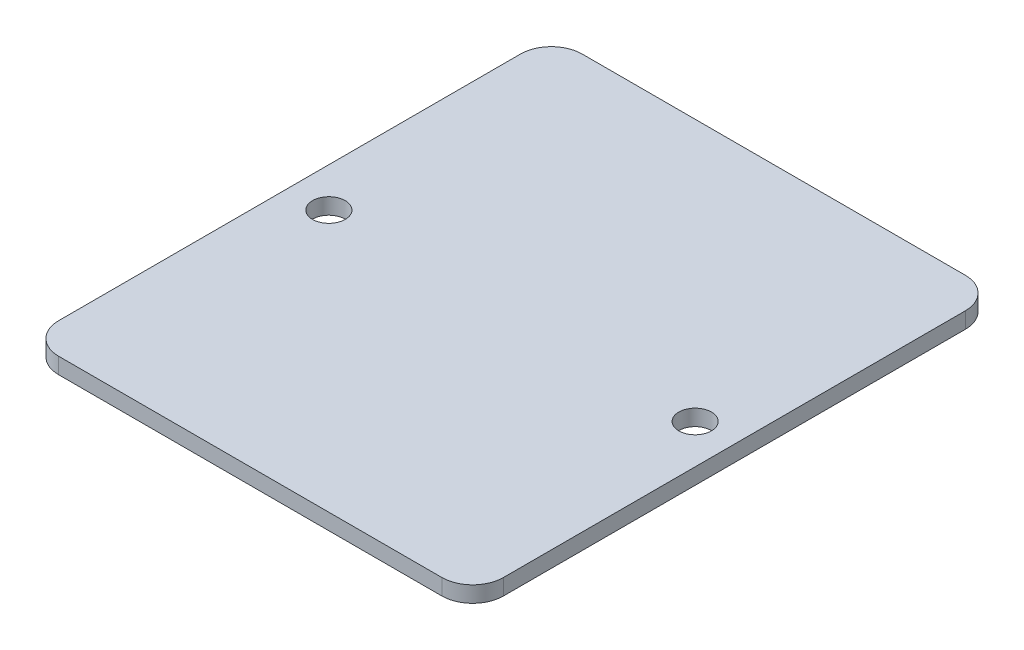
ISO-10303-21;
HEADER;
FILE_DESCRIPTION(('STEP AP214'),'2;1');
FILE_NAME('part.step','',(''),(''),'','','');
FILE_SCHEMA(('AUTOMOTIVE_DESIGN { 1 0 10303 214 1 1 1 1 }'));
ENDSEC;
DATA;
#1=APPLICATION_CONTEXT('core data for automotive mechanical design processes');
#2=APPLICATION_PROTOCOL_DEFINITION('international standard','automotive_design',2000,#1);
#3=PRODUCT_CONTEXT('',#1,'mechanical');
#4=PRODUCT('Part','Part','',(#3));
#5=PRODUCT_RELATED_PRODUCT_CATEGORY('part','',(#4));
#6=PRODUCT_DEFINITION_FORMATION('','',#4);
#7=PRODUCT_DEFINITION_CONTEXT('part definition',#1,'design');
#8=PRODUCT_DEFINITION('design','',#6,#7);
#9=PRODUCT_DEFINITION_SHAPE('','',#8);
#10=(LENGTH_UNIT() NAMED_UNIT(*) SI_UNIT(.MILLI.,.METRE.));
#11=(NAMED_UNIT(*) PLANE_ANGLE_UNIT() SI_UNIT($,.RADIAN.));
#12=(NAMED_UNIT(*) SI_UNIT($,.STERADIAN.) SOLID_ANGLE_UNIT());
#13=UNCERTAINTY_MEASURE_WITH_UNIT(LENGTH_MEASURE(1.E-05),#10,'distance_accuracy_value','');
#14=(GEOMETRIC_REPRESENTATION_CONTEXT(3) GLOBAL_UNCERTAINTY_ASSIGNED_CONTEXT((#13)) GLOBAL_UNIT_ASSIGNED_CONTEXT((#10,
#11,#12)) REPRESENTATION_CONTEXT('',''));
#15=CARTESIAN_POINT('',(0.,0.,0.));
#16=DIRECTION('',(0.,0.,1.));
#17=DIRECTION('',(1.,0.,0.));
#18=AXIS2_PLACEMENT_3D('',#15,#16,#17);
#19=CARTESIAN_POINT('',(-21.625,1.56,-25.45));
#20=DIRECTION('',(1.,0.,0.));
#21=DIRECTION('',(0.,0.,-1.));
#22=AXIS2_PLACEMENT_3D('',#19,#20,#21);
#23=PLANE('',#22);
#24=DIRECTION('',(0.,0.,1.));
#25=VECTOR('',#24,1.);
#26=CARTESIAN_POINT('',(-21.625,1.56,-25.45));
#27=LINE('',#26,#25);
#28=CARTESIAN_POINT('',(-21.625,1.56,-22.45));
#29=VERTEX_POINT('',#28);
#30=CARTESIAN_POINT('',(-21.625,1.56,22.45));
#31=VERTEX_POINT('',#30);
#32=EDGE_CURVE('E124',#29,#31,#27,.T.);
#33=ORIENTED_EDGE('',*,*,#32,.F.);
#34=DIRECTION('',(0.,-1.,0.));
#35=VECTOR('',#34,1.);
#36=CARTESIAN_POINT('',(-21.625,1.56,-22.45));
#37=LINE('',#36,#35);
#38=CARTESIAN_POINT('',(-21.625,0.,-22.45));
#39=VERTEX_POINT('',#38);
#40=EDGE_CURVE('E135',#29,#39,#37,.T.);
#41=ORIENTED_EDGE('',*,*,#40,.T.);
#42=DIRECTION('',(0.,0.,1.));
#43=VECTOR('',#42,1.);
#44=CARTESIAN_POINT('',(-21.625,0.,-25.45));
#45=LINE('',#44,#43);
#46=CARTESIAN_POINT('',(-21.625,0.,22.45));
#47=VERTEX_POINT('',#46);
#48=EDGE_CURVE('E126',#39,#47,#45,.T.);
#49=ORIENTED_EDGE('',*,*,#48,.T.);
#50=DIRECTION('',(0.,-1.,0.));
#51=VECTOR('',#50,1.);
#52=CARTESIAN_POINT('',(-21.625,1.56,22.45));
#53=LINE('',#52,#51);
#54=EDGE_CURVE('E133',#47,#31,#53,.F.);
#55=ORIENTED_EDGE('',*,*,#54,.T.);
#56=EDGE_LOOP('',(#33,#41,#49,#55));
#57=FACE_BOUND('',#56,.T.);
#58=ADVANCED_FACE('F33',(#57),#23,.F.);
#59=CARTESIAN_POINT('',(-21.625,1.56,25.45));
#60=DIRECTION('',(0.,0.,-1.));
#61=DIRECTION('',(-1.,0.,0.));
#62=AXIS2_PLACEMENT_3D('',#59,#60,#61);
#63=PLANE('',#62);
#64=DIRECTION('',(1.,0.,0.));
#65=VECTOR('',#64,1.);
#66=CARTESIAN_POINT('',(-21.625,1.56,25.45));
#67=LINE('',#66,#65);
#68=CARTESIAN_POINT('',(-18.625,1.56,25.45));
#69=VERTEX_POINT('',#68);
#70=CARTESIAN_POINT('',(18.625,1.56,25.45));
#71=VERTEX_POINT('',#70);
#72=EDGE_CURVE('E156',#69,#71,#67,.T.);
#73=ORIENTED_EDGE('',*,*,#72,.F.);
#74=DIRECTION('',(0.,-1.,0.));
#75=VECTOR('',#74,1.);
#76=CARTESIAN_POINT('',(-18.625,1.56,25.45));
#77=LINE('',#76,#75);
#78=CARTESIAN_POINT('',(-18.625,0.,25.45));
#79=VERTEX_POINT('',#78);
#80=EDGE_CURVE('E41',#69,#79,#77,.T.);
#81=ORIENTED_EDGE('',*,*,#80,.T.);
#82=DIRECTION('',(1.,0.,0.));
#83=VECTOR('',#82,1.);
#84=CARTESIAN_POINT('',(-21.625,0.,25.45));
#85=LINE('',#84,#83);
#86=CARTESIAN_POINT('',(18.625,0.,25.45));
#87=VERTEX_POINT('',#86);
#88=EDGE_CURVE('E121',#79,#87,#85,.T.);
#89=ORIENTED_EDGE('',*,*,#88,.T.);
#90=DIRECTION('',(0.,-1.,0.));
#91=VECTOR('',#90,1.);
#92=CARTESIAN_POINT('',(18.625,1.56,25.45));
#93=LINE('',#92,#91);
#94=EDGE_CURVE('E106',#87,#71,#93,.F.);
#95=ORIENTED_EDGE('',*,*,#94,.T.);
#96=EDGE_LOOP('',(#73,#81,#89,#95));
#97=FACE_BOUND('',#96,.T.);
#98=ADVANCED_FACE('F155',(#97),#63,.F.);
#99=CARTESIAN_POINT('',(21.625,1.56,-25.45));
#100=DIRECTION('',(-1.,0.,0.));
#101=DIRECTION('',(0.,0.,1.));
#102=AXIS2_PLACEMENT_3D('',#99,#100,#101);
#103=PLANE('',#102);
#104=DIRECTION('',(0.,0.,-1.));
#105=VECTOR('',#104,1.);
#106=CARTESIAN_POINT('',(21.625,0.,-25.45));
#107=LINE('',#106,#105);
#108=CARTESIAN_POINT('',(21.625,0.,22.45));
#109=VERTEX_POINT('',#108);
#110=CARTESIAN_POINT('',(21.625,0.,-22.45));
#111=VERTEX_POINT('',#110);
#112=EDGE_CURVE('E112',#109,#111,#107,.T.);
#113=ORIENTED_EDGE('',*,*,#112,.T.);
#114=DIRECTION('',(0.,-1.,0.));
#115=VECTOR('',#114,1.);
#116=CARTESIAN_POINT('',(21.625,1.56,-22.45));
#117=LINE('',#116,#115);
#118=CARTESIAN_POINT('',(21.625,1.56,-22.45));
#119=VERTEX_POINT('',#118);
#120=EDGE_CURVE('E11',#111,#119,#117,.F.);
#121=ORIENTED_EDGE('',*,*,#120,.T.);
#122=DIRECTION('',(0.,0.,-1.));
#123=VECTOR('',#122,1.);
#124=CARTESIAN_POINT('',(21.625,1.56,-25.45));
#125=LINE('',#124,#123);
#126=CARTESIAN_POINT('',(21.625,1.56,22.45));
#127=VERTEX_POINT('',#126);
#128=EDGE_CURVE('E113',#127,#119,#125,.T.);
#129=ORIENTED_EDGE('',*,*,#128,.F.);
#130=DIRECTION('',(0.,-1.,0.));
#131=VECTOR('',#130,1.);
#132=CARTESIAN_POINT('',(21.625,1.56,22.45));
#133=LINE('',#132,#131);
#134=EDGE_CURVE('E104',#127,#109,#133,.T.);
#135=ORIENTED_EDGE('',*,*,#134,.T.);
#136=EDGE_LOOP('',(#113,#121,#129,#135));
#137=FACE_BOUND('',#136,.T.);
#138=ADVANCED_FACE('F111',(#137),#103,.F.);
#139=CARTESIAN_POINT('',(-21.625,1.56,-25.45));
#140=DIRECTION('',(0.,0.,1.));
#141=DIRECTION('',(1.,0.,0.));
#142=AXIS2_PLACEMENT_3D('',#139,#140,#141);
#143=PLANE('',#142);
#144=DIRECTION('',(-1.,0.,0.));
#145=VECTOR('',#144,1.);
#146=CARTESIAN_POINT('',(-21.625,0.,-25.45));
#147=LINE('',#146,#145);
#148=CARTESIAN_POINT('',(18.625,0.,-25.45));
#149=VERTEX_POINT('',#148);
#150=CARTESIAN_POINT('',(-18.625,0.,-25.45));
#151=VERTEX_POINT('',#150);
#152=EDGE_CURVE('E120',#149,#151,#147,.T.);
#153=ORIENTED_EDGE('',*,*,#152,.T.);
#154=DIRECTION('',(0.,-1.,0.));
#155=VECTOR('',#154,1.);
#156=CARTESIAN_POINT('',(-18.625,1.56,-25.45));
#157=LINE('',#156,#155);
#158=CARTESIAN_POINT('',(-18.625,1.56,-25.45));
#159=VERTEX_POINT('',#158);
#160=EDGE_CURVE('E146',#151,#159,#157,.F.);
#161=ORIENTED_EDGE('',*,*,#160,.T.);
#162=DIRECTION('',(-1.,0.,0.));
#163=VECTOR('',#162,1.);
#164=CARTESIAN_POINT('',(-21.625,1.56,-25.45));
#165=LINE('',#164,#163);
#166=CARTESIAN_POINT('',(18.625,1.56,-25.45));
#167=VERTEX_POINT('',#166);
#168=EDGE_CURVE('E114',#167,#159,#165,.T.);
#169=ORIENTED_EDGE('',*,*,#168,.F.);
#170=DIRECTION('',(0.,-1.,0.));
#171=VECTOR('',#170,1.);
#172=CARTESIAN_POINT('',(18.625,1.56,-25.45));
#173=LINE('',#172,#171);
#174=EDGE_CURVE('E143',#167,#149,#173,.T.);
#175=ORIENTED_EDGE('',*,*,#174,.T.);
#176=EDGE_LOOP('',(#153,#161,#169,#175));
#177=FACE_BOUND('',#176,.T.);
#178=ADVANCED_FACE('F193',(#177),#143,.F.);
#179=CARTESIAN_POINT('',(0.,1.56,0.));
#180=DIRECTION('',(0.,1.,0.));
#181=DIRECTION('',(0.,0.,1.));
#182=AXIS2_PLACEMENT_3D('',#179,#180,#181);
#183=PLANE('',#182);
#184=CARTESIAN_POINT('',(17.805,1.56,0.));
#185=DIRECTION('',(0.,1.,0.));
#186=DIRECTION('',(0.,0.,1.));
#187=AXIS2_PLACEMENT_3D('',#184,#185,#186);
#188=CIRCLE('',#187,1.5875);
#189=CARTESIAN_POINT('',(17.805,1.56,1.5875));
#190=VERTEX_POINT('',#189);
#191=EDGE_CURVE('E251',#190,#190,#188,.T.);
#192=ORIENTED_EDGE('',*,*,#191,.F.);
#193=EDGE_LOOP('',(#192));
#194=FACE_BOUND('',#193,.T.);
#195=CARTESIAN_POINT('',(-17.805,1.56,0.));
#196=DIRECTION('',(0.,1.,0.));
#197=DIRECTION('',(0.,0.,1.));
#198=AXIS2_PLACEMENT_3D('',#195,#196,#197);
#199=CIRCLE('',#198,1.5875);
#200=CARTESIAN_POINT('',(-17.805,1.56,1.5875));
#201=VERTEX_POINT('',#200);
#202=EDGE_CURVE('E253',#201,#201,#199,.T.);
#203=ORIENTED_EDGE('',*,*,#202,.F.);
#204=EDGE_LOOP('',(#203));
#205=FACE_BOUND('',#204,.T.);
#206=ORIENTED_EDGE('',*,*,#168,.T.);
#207=CARTESIAN_POINT('',(-18.625,1.56,-22.45));
#208=DIRECTION('',(0.,1.,0.));
#209=DIRECTION('',(0.,0.,1.));
#210=AXIS2_PLACEMENT_3D('',#207,#208,#209);
#211=CIRCLE('',#210,3.);
#212=EDGE_CURVE('E151',#159,#29,#211,.T.);
#213=ORIENTED_EDGE('',*,*,#212,.T.);
#214=ORIENTED_EDGE('',*,*,#32,.T.);
#215=CARTESIAN_POINT('',(-18.625,1.56,22.45));
#216=DIRECTION('',(0.,1.,0.));
#217=DIRECTION('',(0.,0.,1.));
#218=AXIS2_PLACEMENT_3D('',#215,#216,#217);
#219=CIRCLE('',#218,3.);
#220=EDGE_CURVE('E54',#31,#69,#219,.T.);
#221=ORIENTED_EDGE('',*,*,#220,.T.);
#222=ORIENTED_EDGE('',*,*,#72,.T.);
#223=CARTESIAN_POINT('',(18.625,1.56,22.45));
#224=DIRECTION('',(0.,1.,0.));
#225=DIRECTION('',(0.,0.,1.));
#226=AXIS2_PLACEMENT_3D('',#223,#224,#225);
#227=CIRCLE('',#226,3.);
#228=EDGE_CURVE('E131',#71,#127,#227,.T.);
#229=ORIENTED_EDGE('',*,*,#228,.T.);
#230=ORIENTED_EDGE('',*,*,#128,.T.);
#231=CARTESIAN_POINT('',(18.625,1.56,-22.45));
#232=DIRECTION('',(0.,1.,0.));
#233=DIRECTION('',(0.,0.,1.));
#234=AXIS2_PLACEMENT_3D('',#231,#232,#233);
#235=CIRCLE('',#234,3.);
#236=EDGE_CURVE('E148',#119,#167,#235,.T.);
#237=ORIENTED_EDGE('',*,*,#236,.T.);
#238=EDGE_LOOP('',(#206,#213,#214,#221,#222,#229,#230,#237));
#239=FACE_BOUND('',#238,.T.);
#240=ADVANCED_FACE('F187',(#194,#205,#239),#183,.T.);
#241=CARTESIAN_POINT('',(0.,0.,0.));
#242=DIRECTION('',(0.,1.,0.));
#243=DIRECTION('',(0.,0.,1.));
#244=AXIS2_PLACEMENT_3D('',#241,#242,#243);
#245=PLANE('',#244);
#246=CARTESIAN_POINT('',(17.805,0.,0.));
#247=DIRECTION('',(0.,1.,0.));
#248=DIRECTION('',(0.,0.,1.));
#249=AXIS2_PLACEMENT_3D('',#246,#247,#248);
#250=CIRCLE('',#249,1.5875);
#251=CARTESIAN_POINT('',(17.805,0.,1.5875));
#252=VERTEX_POINT('',#251);
#253=EDGE_CURVE('E248',#252,#252,#250,.T.);
#254=ORIENTED_EDGE('',*,*,#253,.T.);
#255=EDGE_LOOP('',(#254));
#256=FACE_BOUND('',#255,.T.);
#257=CARTESIAN_POINT('',(-17.805,0.,0.));
#258=DIRECTION('',(0.,1.,0.));
#259=DIRECTION('',(0.,0.,1.));
#260=AXIS2_PLACEMENT_3D('',#257,#258,#259);
#261=CIRCLE('',#260,1.5875);
#262=CARTESIAN_POINT('',(-17.805,0.,1.5875));
#263=VERTEX_POINT('',#262);
#264=EDGE_CURVE('E163',#263,#263,#261,.T.);
#265=ORIENTED_EDGE('',*,*,#264,.T.);
#266=EDGE_LOOP('',(#265));
#267=FACE_BOUND('',#266,.T.);
#268=ORIENTED_EDGE('',*,*,#48,.F.);
#269=CARTESIAN_POINT('',(-18.625,0.,-22.45));
#270=DIRECTION('',(0.,1.,0.));
#271=DIRECTION('',(0.,0.,1.));
#272=AXIS2_PLACEMENT_3D('',#269,#270,#271);
#273=CIRCLE('',#272,3.);
#274=EDGE_CURVE('E141',#39,#151,#273,.F.);
#275=ORIENTED_EDGE('',*,*,#274,.T.);
#276=ORIENTED_EDGE('',*,*,#152,.F.);
#277=CARTESIAN_POINT('',(18.625,0.,-22.45));
#278=DIRECTION('',(0.,1.,0.));
#279=DIRECTION('',(0.,0.,1.));
#280=AXIS2_PLACEMENT_3D('',#277,#278,#279);
#281=CIRCLE('',#280,3.);
#282=EDGE_CURVE('E119',#149,#111,#281,.F.);
#283=ORIENTED_EDGE('',*,*,#282,.T.);
#284=ORIENTED_EDGE('',*,*,#112,.F.);
#285=CARTESIAN_POINT('',(18.625,0.,22.45));
#286=DIRECTION('',(0.,1.,0.));
#287=DIRECTION('',(0.,0.,1.));
#288=AXIS2_PLACEMENT_3D('',#285,#286,#287);
#289=CIRCLE('',#288,3.);
#290=EDGE_CURVE('E100',#109,#87,#289,.F.);
#291=ORIENTED_EDGE('',*,*,#290,.T.);
#292=ORIENTED_EDGE('',*,*,#88,.F.);
#293=CARTESIAN_POINT('',(-18.625,0.,22.45));
#294=DIRECTION('',(0.,1.,0.));
#295=DIRECTION('',(0.,0.,1.));
#296=AXIS2_PLACEMENT_3D('',#293,#294,#295);
#297=CIRCLE('',#296,3.);
#298=EDGE_CURVE('E139',#79,#47,#297,.F.);
#299=ORIENTED_EDGE('',*,*,#298,.T.);
#300=EDGE_LOOP('',(#268,#275,#276,#283,#284,#291,#292,#299));
#301=FACE_BOUND('',#300,.T.);
#302=ADVANCED_FACE('F117',(#256,#267,#301),#245,.F.);
#303=CARTESIAN_POINT('',(18.625,1.56,22.45));
#304=DIRECTION('',(0.,-1.,0.));
#305=DIRECTION('',(0.,0.,-1.));
#306=AXIS2_PLACEMENT_3D('',#303,#304,#305);
#307=CYLINDRICAL_SURFACE('',#306,3.);
#308=ORIENTED_EDGE('',*,*,#228,.F.);
#309=ORIENTED_EDGE('',*,*,#94,.F.);
#310=ORIENTED_EDGE('',*,*,#290,.F.);
#311=ORIENTED_EDGE('',*,*,#134,.F.);
#312=EDGE_LOOP('',(#308,#309,#310,#311));
#313=FACE_BOUND('',#312,.T.);
#314=ADVANCED_FACE('F103',(#313),#307,.T.);
#315=CARTESIAN_POINT('',(-18.625,1.56,-22.45));
#316=DIRECTION('',(0.,-1.,0.));
#317=DIRECTION('',(0.,0.,-1.));
#318=AXIS2_PLACEMENT_3D('',#315,#316,#317);
#319=CYLINDRICAL_SURFACE('',#318,3.);
#320=ORIENTED_EDGE('',*,*,#212,.F.);
#321=ORIENTED_EDGE('',*,*,#160,.F.);
#322=ORIENTED_EDGE('',*,*,#274,.F.);
#323=ORIENTED_EDGE('',*,*,#40,.F.);
#324=EDGE_LOOP('',(#320,#321,#322,#323));
#325=FACE_BOUND('',#324,.T.);
#326=ADVANCED_FACE('F166',(#325),#319,.T.);
#327=CARTESIAN_POINT('',(-18.625,1.56,22.45));
#328=DIRECTION('',(0.,-1.,0.));
#329=DIRECTION('',(0.,0.,-1.));
#330=AXIS2_PLACEMENT_3D('',#327,#328,#329);
#331=CYLINDRICAL_SURFACE('',#330,3.);
#332=ORIENTED_EDGE('',*,*,#220,.F.);
#333=ORIENTED_EDGE('',*,*,#54,.F.);
#334=ORIENTED_EDGE('',*,*,#298,.F.);
#335=ORIENTED_EDGE('',*,*,#80,.F.);
#336=EDGE_LOOP('',(#332,#333,#334,#335));
#337=FACE_BOUND('',#336,.T.);
#338=ADVANCED_FACE('F164',(#337),#331,.T.);
#339=CARTESIAN_POINT('',(18.625,1.56,-22.45));
#340=DIRECTION('',(0.,-1.,0.));
#341=DIRECTION('',(0.,0.,-1.));
#342=AXIS2_PLACEMENT_3D('',#339,#340,#341);
#343=CYLINDRICAL_SURFACE('',#342,3.);
#344=ORIENTED_EDGE('',*,*,#236,.F.);
#345=ORIENTED_EDGE('',*,*,#120,.F.);
#346=ORIENTED_EDGE('',*,*,#282,.F.);
#347=ORIENTED_EDGE('',*,*,#174,.F.);
#348=EDGE_LOOP('',(#344,#345,#346,#347));
#349=FACE_BOUND('',#348,.T.);
#350=ADVANCED_FACE('F35',(#349),#343,.T.);
#351=CARTESIAN_POINT('',(-17.805,0.,0.));
#352=DIRECTION('',(0.,1.,0.));
#353=DIRECTION('',(0.,0.,1.));
#354=AXIS2_PLACEMENT_3D('',#351,#352,#353);
#355=CYLINDRICAL_SURFACE('',#354,1.5875);
#356=CARTESIAN_POINT('',(-17.805,0.,1.5875));
#357=CARTESIAN_POINT('',(-17.805,0.01625,1.5875));
#358=CARTESIAN_POINT('',(-17.805,0.0325,1.5875));
#359=CARTESIAN_POINT('',(-17.805,0.065,1.5875));
#360=CARTESIAN_POINT('',(-17.805,0.08125,1.5875));
#361=CARTESIAN_POINT('',(-17.805,0.11375,1.5875));
#362=CARTESIAN_POINT('',(-17.805,0.13,1.5875));
#363=CARTESIAN_POINT('',(-17.805,0.1625,1.5875));
#364=CARTESIAN_POINT('',(-17.805,0.17875,1.5875));
#365=CARTESIAN_POINT('',(-17.805,0.21125,1.5875));
#366=CARTESIAN_POINT('',(-17.805,0.2275,1.5875));
#367=CARTESIAN_POINT('',(-17.805,0.26,1.5875));
#368=CARTESIAN_POINT('',(-17.805,0.27625,1.5875));
#369=CARTESIAN_POINT('',(-17.805,0.30875,1.5875));
#370=CARTESIAN_POINT('',(-17.805,0.325,1.5875));
#371=CARTESIAN_POINT('',(-17.805,0.3575,1.5875));
#372=CARTESIAN_POINT('',(-17.805,0.37375,1.5875));
#373=CARTESIAN_POINT('',(-17.805,0.40625,1.5875));
#374=CARTESIAN_POINT('',(-17.805,0.4225,1.5875));
#375=CARTESIAN_POINT('',(-17.805,0.455,1.5875));
#376=CARTESIAN_POINT('',(-17.805,0.47125,1.5875));
#377=CARTESIAN_POINT('',(-17.805,0.50375,1.5875));
#378=CARTESIAN_POINT('',(-17.805,0.52,1.5875));
#379=CARTESIAN_POINT('',(-17.805,0.5525,1.5875));
#380=CARTESIAN_POINT('',(-17.805,0.56875,1.5875));
#381=CARTESIAN_POINT('',(-17.805,0.60125,1.5875));
#382=CARTESIAN_POINT('',(-17.805,0.6175,1.5875));
#383=CARTESIAN_POINT('',(-17.805,0.65,1.5875));
#384=CARTESIAN_POINT('',(-17.805,0.66625,1.5875));
#385=CARTESIAN_POINT('',(-17.805,0.69875,1.5875));
#386=CARTESIAN_POINT('',(-17.805,0.715,1.5875));
#387=CARTESIAN_POINT('',(-17.805,0.7475,1.5875));
#388=CARTESIAN_POINT('',(-17.805,0.76375,1.5875));
#389=CARTESIAN_POINT('',(-17.805,0.79625,1.5875));
#390=CARTESIAN_POINT('',(-17.805,0.8125,1.5875));
#391=CARTESIAN_POINT('',(-17.805,0.845,1.5875));
#392=CARTESIAN_POINT('',(-17.805,0.86125,1.5875));
#393=CARTESIAN_POINT('',(-17.805,0.89375,1.5875));
#394=CARTESIAN_POINT('',(-17.805,0.91,1.5875));
#395=CARTESIAN_POINT('',(-17.805,0.9425,1.5875));
#396=CARTESIAN_POINT('',(-17.805,0.95875,1.5875));
#397=CARTESIAN_POINT('',(-17.805,0.99125,1.5875));
#398=CARTESIAN_POINT('',(-17.805,1.0075,1.5875));
#399=CARTESIAN_POINT('',(-17.805,1.04,1.5875));
#400=CARTESIAN_POINT('',(-17.805,1.05625,1.5875));
#401=CARTESIAN_POINT('',(-17.805,1.08875,1.5875));
#402=CARTESIAN_POINT('',(-17.805,1.105,1.5875));
#403=CARTESIAN_POINT('',(-17.805,1.1375,1.5875));
#404=CARTESIAN_POINT('',(-17.805,1.15375,1.5875));
#405=CARTESIAN_POINT('',(-17.805,1.18625,1.5875));
#406=CARTESIAN_POINT('',(-17.805,1.2025,1.5875));
#407=CARTESIAN_POINT('',(-17.805,1.235,1.5875));
#408=CARTESIAN_POINT('',(-17.805,1.25125,1.5875));
#409=CARTESIAN_POINT('',(-17.805,1.28375,1.5875));
#410=CARTESIAN_POINT('',(-17.805,1.3,1.5875));
#411=CARTESIAN_POINT('',(-17.805,1.3325,1.5875));
#412=CARTESIAN_POINT('',(-17.805,1.34875,1.5875));
#413=CARTESIAN_POINT('',(-17.805,1.38125,1.5875));
#414=CARTESIAN_POINT('',(-17.805,1.3975,1.5875));
#415=CARTESIAN_POINT('',(-17.805,1.43,1.5875));
#416=CARTESIAN_POINT('',(-17.805,1.44625,1.5875));
#417=CARTESIAN_POINT('',(-17.805,1.47875,1.5875));
#418=CARTESIAN_POINT('',(-17.805,1.495,1.5875));
#419=CARTESIAN_POINT('',(-17.805,1.5275,1.5875));
#420=CARTESIAN_POINT('',(-17.805,1.54375,1.5875));
#421=CARTESIAN_POINT('',(-17.805,1.56,1.5875));
#422=B_SPLINE_CURVE_WITH_KNOTS('',3,(#356,#357,#358,#359,#360,#361,#362,#363,#364,#365,#366,
#367,#368,#369,#370,#371,#372,#373,#374,#375,#376,#377,#378,#379,#380,#381,#382,#383,#384,#385,
#386,#387,#388,#389,#390,#391,#392,#393,#394,#395,#396,#397,#398,#399,#400,#401,#402,#403,#404,
#405,#406,#407,#408,#409,#410,#411,#412,#413,#414,#415,#416,#417,#418,#419,#420,#421),
.UNSPECIFIED.,.F.,.F.,(4,2,2,2,2,2,2,2,2,2,2,2,2,2,2,2,2,2,2,2,2,2,2,2,2,2,2,2,2,2,2,2,4),(0.,
0.04875,0.0975,0.14625,0.195,0.24375,0.2925,0.34125,0.39,0.43875,0.4875,0.53625,0.585,0.63375,
0.6825,0.73125,0.78,0.82875,0.8775,0.92625,0.975,1.02375,1.0725,1.12125,1.17,1.21875,1.2675,
1.31625,1.365,1.41375,1.4625,1.51125,1.56),.UNSPECIFIED.);
#423=EDGE_CURVE('BSEAM171',#263,#201,#422,.T.);
#424=ORIENTED_EDGE('',*,*,#264,.F.);
#425=ORIENTED_EDGE('',*,*,#202,.T.);
#426=ORIENTED_EDGE('',*,*,#423,.T.);
#427=ORIENTED_EDGE('',*,*,#423,.F.);
#428=EDGE_LOOP('',(#424,#426,#425,#427));
#429=FACE_BOUND('',#428,.T.);
#430=ADVANCED_FACE('F171',(#429),#355,.F.);
#431=CARTESIAN_POINT('',(17.805,0.,0.));
#432=DIRECTION('',(0.,1.,0.));
#433=DIRECTION('',(0.,0.,1.));
#434=AXIS2_PLACEMENT_3D('',#431,#432,#433);
#435=CYLINDRICAL_SURFACE('',#434,1.5875);
#436=CARTESIAN_POINT('',(17.805,0.,1.5875));
#437=CARTESIAN_POINT('',(17.805,0.01625,1.5875));
#438=CARTESIAN_POINT('',(17.805,0.0325,1.5875));
#439=CARTESIAN_POINT('',(17.805,0.065,1.5875));
#440=CARTESIAN_POINT('',(17.805,0.08125,1.5875));
#441=CARTESIAN_POINT('',(17.805,0.11375,1.5875));
#442=CARTESIAN_POINT('',(17.805,0.13,1.5875));
#443=CARTESIAN_POINT('',(17.805,0.1625,1.5875));
#444=CARTESIAN_POINT('',(17.805,0.17875,1.5875));
#445=CARTESIAN_POINT('',(17.805,0.21125,1.5875));
#446=CARTESIAN_POINT('',(17.805,0.2275,1.5875));
#447=CARTESIAN_POINT('',(17.805,0.26,1.5875));
#448=CARTESIAN_POINT('',(17.805,0.27625,1.5875));
#449=CARTESIAN_POINT('',(17.805,0.30875,1.5875));
#450=CARTESIAN_POINT('',(17.805,0.325,1.5875));
#451=CARTESIAN_POINT('',(17.805,0.3575,1.5875));
#452=CARTESIAN_POINT('',(17.805,0.37375,1.5875));
#453=CARTESIAN_POINT('',(17.805,0.40625,1.5875));
#454=CARTESIAN_POINT('',(17.805,0.4225,1.5875));
#455=CARTESIAN_POINT('',(17.805,0.455,1.5875));
#456=CARTESIAN_POINT('',(17.805,0.47125,1.5875));
#457=CARTESIAN_POINT('',(17.805,0.50375,1.5875));
#458=CARTESIAN_POINT('',(17.805,0.52,1.5875));
#459=CARTESIAN_POINT('',(17.805,0.5525,1.5875));
#460=CARTESIAN_POINT('',(17.805,0.56875,1.5875));
#461=CARTESIAN_POINT('',(17.805,0.60125,1.5875));
#462=CARTESIAN_POINT('',(17.805,0.6175,1.5875));
#463=CARTESIAN_POINT('',(17.805,0.65,1.5875));
#464=CARTESIAN_POINT('',(17.805,0.66625,1.5875));
#465=CARTESIAN_POINT('',(17.805,0.69875,1.5875));
#466=CARTESIAN_POINT('',(17.805,0.715,1.5875));
#467=CARTESIAN_POINT('',(17.805,0.7475,1.5875));
#468=CARTESIAN_POINT('',(17.805,0.76375,1.5875));
#469=CARTESIAN_POINT('',(17.805,0.79625,1.5875));
#470=CARTESIAN_POINT('',(17.805,0.8125,1.5875));
#471=CARTESIAN_POINT('',(17.805,0.845,1.5875));
#472=CARTESIAN_POINT('',(17.805,0.86125,1.5875));
#473=CARTESIAN_POINT('',(17.805,0.89375,1.5875));
#474=CARTESIAN_POINT('',(17.805,0.91,1.5875));
#475=CARTESIAN_POINT('',(17.805,0.9425,1.5875));
#476=CARTESIAN_POINT('',(17.805,0.95875,1.5875));
#477=CARTESIAN_POINT('',(17.805,0.99125,1.5875));
#478=CARTESIAN_POINT('',(17.805,1.0075,1.5875));
#479=CARTESIAN_POINT('',(17.805,1.04,1.5875));
#480=CARTESIAN_POINT('',(17.805,1.05625,1.5875));
#481=CARTESIAN_POINT('',(17.805,1.08875,1.5875));
#482=CARTESIAN_POINT('',(17.805,1.105,1.5875));
#483=CARTESIAN_POINT('',(17.805,1.1375,1.5875));
#484=CARTESIAN_POINT('',(17.805,1.15375,1.5875));
#485=CARTESIAN_POINT('',(17.805,1.18625,1.5875));
#486=CARTESIAN_POINT('',(17.805,1.2025,1.5875));
#487=CARTESIAN_POINT('',(17.805,1.235,1.5875));
#488=CARTESIAN_POINT('',(17.805,1.25125,1.5875));
#489=CARTESIAN_POINT('',(17.805,1.28375,1.5875));
#490=CARTESIAN_POINT('',(17.805,1.3,1.5875));
#491=CARTESIAN_POINT('',(17.805,1.3325,1.5875));
#492=CARTESIAN_POINT('',(17.805,1.34875,1.5875));
#493=CARTESIAN_POINT('',(17.805,1.38125,1.5875));
#494=CARTESIAN_POINT('',(17.805,1.3975,1.5875));
#495=CARTESIAN_POINT('',(17.805,1.43,1.5875));
#496=CARTESIAN_POINT('',(17.805,1.44625,1.5875));
#497=CARTESIAN_POINT('',(17.805,1.47875,1.5875));
#498=CARTESIAN_POINT('',(17.805,1.495,1.5875));
#499=CARTESIAN_POINT('',(17.805,1.5275,1.5875));
#500=CARTESIAN_POINT('',(17.805,1.54375,1.5875));
#501=CARTESIAN_POINT('',(17.805,1.56,1.5875));
#502=B_SPLINE_CURVE_WITH_KNOTS('',3,(#436,#437,#438,#439,#440,#441,#442,#443,#444,#445,#446,
#447,#448,#449,#450,#451,#452,#453,#454,#455,#456,#457,#458,#459,#460,#461,#462,#463,#464,#465,
#466,#467,#468,#469,#470,#471,#472,#473,#474,#475,#476,#477,#478,#479,#480,#481,#482,#483,#484,
#485,#486,#487,#488,#489,#490,#491,#492,#493,#494,#495,#496,#497,#498,#499,#500,#501),
.UNSPECIFIED.,.F.,.F.,(4,2,2,2,2,2,2,2,2,2,2,2,2,2,2,2,2,2,2,2,2,2,2,2,2,2,2,2,2,2,2,2,4),(0.,
0.04875,0.0975,0.14625,0.195,0.24375,0.2925,0.34125,0.39,0.43875,0.4875,0.53625,0.585,0.63375,
0.6825,0.73125,0.78,0.82875,0.8775,0.92625,0.975,1.02375,1.0725,1.12125,1.17,1.21875,1.2675,
1.31625,1.365,1.41375,1.4625,1.51125,1.56),.UNSPECIFIED.);
#503=EDGE_CURVE('BSEAM233',#252,#190,#502,.T.);
#504=ORIENTED_EDGE('',*,*,#253,.F.);
#505=ORIENTED_EDGE('',*,*,#191,.T.);
#506=ORIENTED_EDGE('',*,*,#503,.T.);
#507=ORIENTED_EDGE('',*,*,#503,.F.);
#508=EDGE_LOOP('',(#504,#506,#505,#507));
#509=FACE_BOUND('',#508,.T.);
#510=ADVANCED_FACE('F233',(#509),#435,.F.);
#511=CLOSED_SHELL('',(#58,#98,#138,#178,#240,#302,#314,#326,#338,#350,#430,#510));
#512=MANIFOLD_SOLID_BREP('B2',#511);
#513=ADVANCED_BREP_SHAPE_REPRESENTATION('',(#18,#512),#14);
#514=SHAPE_DEFINITION_REPRESENTATION(#9,#513);
ENDSEC;
END-ISO-10303-21;
